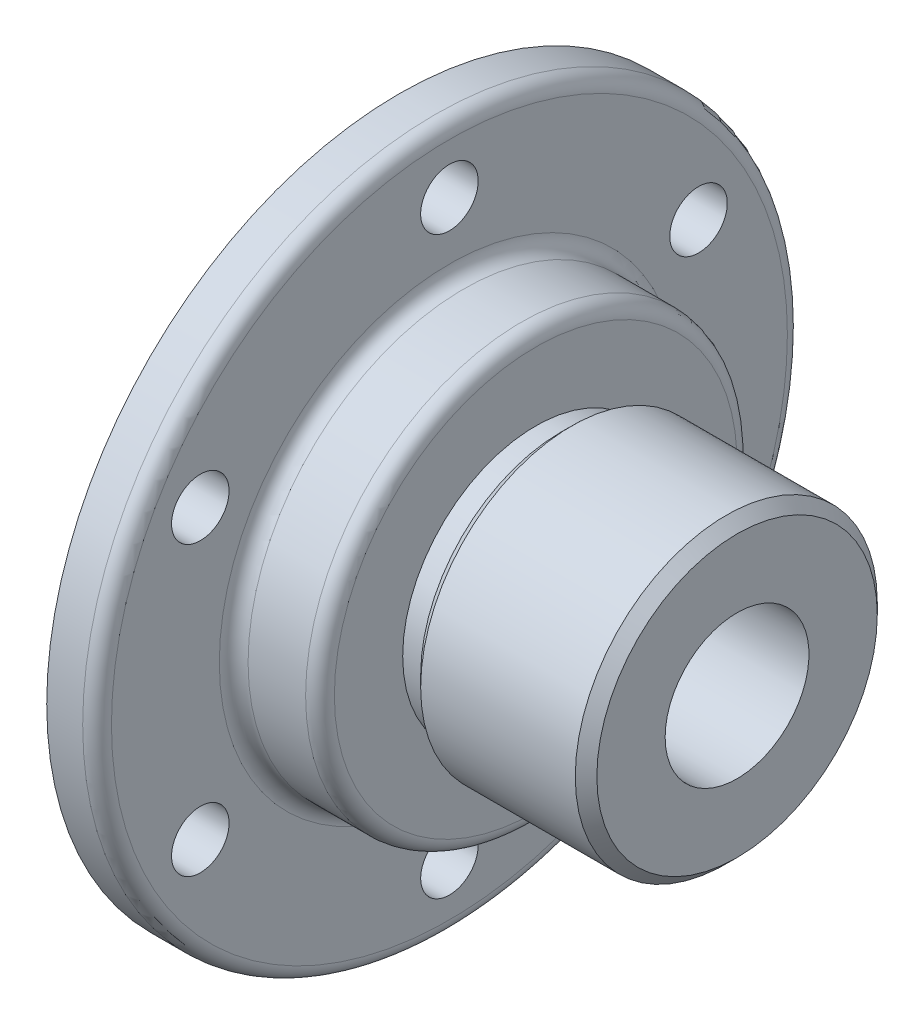
ISO-10303-21;
HEADER;
FILE_DESCRIPTION(('STEP AP214'),'2;1');
FILE_NAME('part.step','',(''),(''),'','','');
FILE_SCHEMA(('AUTOMOTIVE_DESIGN { 1 0 10303 214 1 1 1 1 }'));
ENDSEC;
DATA;
#1=APPLICATION_CONTEXT('core data for automotive mechanical design processes');
#2=APPLICATION_PROTOCOL_DEFINITION('international standard','automotive_design',2000,#1);
#3=PRODUCT_CONTEXT('',#1,'mechanical');
#4=PRODUCT('Part','Part','',(#3));
#5=PRODUCT_RELATED_PRODUCT_CATEGORY('part','',(#4));
#6=PRODUCT_DEFINITION_FORMATION('','',#4);
#7=PRODUCT_DEFINITION_CONTEXT('part definition',#1,'design');
#8=PRODUCT_DEFINITION('design','',#6,#7);
#9=PRODUCT_DEFINITION_SHAPE('','',#8);
#10=(LENGTH_UNIT() NAMED_UNIT(*) SI_UNIT(.MILLI.,.METRE.));
#11=(NAMED_UNIT(*) PLANE_ANGLE_UNIT() SI_UNIT($,.RADIAN.));
#12=(NAMED_UNIT(*) SI_UNIT($,.STERADIAN.) SOLID_ANGLE_UNIT());
#13=UNCERTAINTY_MEASURE_WITH_UNIT(LENGTH_MEASURE(1.E-05),#10,'distance_accuracy_value','');
#14=(GEOMETRIC_REPRESENTATION_CONTEXT(3) GLOBAL_UNCERTAINTY_ASSIGNED_CONTEXT((#13)) GLOBAL_UNIT_ASSIGNED_CONTEXT((#10,
#11,#12)) REPRESENTATION_CONTEXT('',''));
#15=CARTESIAN_POINT('',(0.,0.,0.));
#16=DIRECTION('',(0.,0.,1.));
#17=DIRECTION('',(1.,0.,0.));
#18=AXIS2_PLACEMENT_3D('',#15,#16,#17);
#19=CARTESIAN_POINT('',(0.,0.,0.));
#20=DIRECTION('',(1.,0.,0.));
#21=DIRECTION('',(0.,0.,-1.));
#22=AXIS2_PLACEMENT_3D('',#19,#20,#21);
#23=PLANE('',#22);
#24=CARTESIAN_POINT('',(0.,20.0000000000004,34.6410161513773));
#25=DIRECTION('',(1.,0.,0.));
#26=DIRECTION('',(0.,0.866025403784433,-0.50000000000001));
#27=AXIS2_PLACEMENT_3D('',#24,#25,#26);
#28=CIRCLE('',#27,4.);
#29=CARTESIAN_POINT('',(0.,23.4641016151381,32.6410161513773));
#30=VERTEX_POINT('',#29);
#31=EDGE_CURVE('E115',#30,#30,#28,.T.);
#32=ORIENTED_EDGE('',*,*,#31,.T.);
#33=EDGE_LOOP('',(#32));
#34=FACE_BOUND('',#33,.T.);
#35=CARTESIAN_POINT('',(0.,-19.9999999999997,34.6410161513777));
#36=DIRECTION('',(1.,0.,0.));
#37=DIRECTION('',(0.,0.866025403784443,0.499999999999992));
#38=AXIS2_PLACEMENT_3D('',#35,#36,#37);
#39=CIRCLE('',#38,4.);
#40=CARTESIAN_POINT('',(0.,-16.5358983848619,36.6410161513777));
#41=VERTEX_POINT('',#40);
#42=EDGE_CURVE('E109',#41,#41,#39,.T.);
#43=ORIENTED_EDGE('',*,*,#42,.T.);
#44=EDGE_LOOP('',(#43));
#45=FACE_BOUND('',#44,.T.);
#46=CARTESIAN_POINT('',(0.,-40.,2.79318668888751E-13));
#47=DIRECTION('',(1.,0.,0.));
#48=DIRECTION('',(0.,0.,1.));
#49=AXIS2_PLACEMENT_3D('',#46,#47,#48);
#50=CIRCLE('',#49,4.);
#51=CARTESIAN_POINT('',(0.,-40.,4.00000000000028));
#52=VERTEX_POINT('',#51);
#53=EDGE_CURVE('E103',#52,#52,#50,.T.);
#54=ORIENTED_EDGE('',*,*,#53,.T.);
#55=EDGE_LOOP('',(#54));
#56=FACE_BOUND('',#55,.T.);
#57=CARTESIAN_POINT('',(0.,-20.0000000000002,-34.6410161513775));
#58=DIRECTION('',(1.,0.,0.));
#59=DIRECTION('',(0.,-0.866025403784436,0.500000000000004));
#60=AXIS2_PLACEMENT_3D('',#57,#58,#59);
#61=CIRCLE('',#60,4.);
#62=CARTESIAN_POINT('',(0.,-23.4641016151379,-32.6410161513774));
#63=VERTEX_POINT('',#62);
#64=EDGE_CURVE('E97',#63,#63,#61,.T.);
#65=ORIENTED_EDGE('',*,*,#64,.T.);
#66=EDGE_LOOP('',(#65));
#67=FACE_BOUND('',#66,.T.);
#68=CARTESIAN_POINT('',(0.,19.9999999999999,-34.6410161513776));
#69=DIRECTION('',(1.,0.,0.));
#70=DIRECTION('',(0.,-0.86602540378444,-0.499999999999998));
#71=AXIS2_PLACEMENT_3D('',#68,#69,#70);
#72=CIRCLE('',#71,4.);
#73=CARTESIAN_POINT('',(0.,16.5358983848622,-36.6410161513776));
#74=VERTEX_POINT('',#73);
#75=EDGE_CURVE('E91',#74,#74,#72,.T.);
#76=ORIENTED_EDGE('',*,*,#75,.T.);
#77=EDGE_LOOP('',(#76));
#78=FACE_BOUND('',#77,.T.);
#79=CARTESIAN_POINT('',(0.,40.,0.));
#80=DIRECTION('',(1.,0.,0.));
#81=DIRECTION('',(0.,0.,-1.));
#82=AXIS2_PLACEMENT_3D('',#79,#80,#81);
#83=CIRCLE('',#82,4.);
#84=CARTESIAN_POINT('',(0.,40.,-4.));
#85=VERTEX_POINT('',#84);
#86=EDGE_CURVE('E87',#85,#85,#83,.T.);
#87=ORIENTED_EDGE('',*,*,#86,.T.);
#88=EDGE_LOOP('',(#87));
#89=FACE_BOUND('',#88,.T.);
#90=CARTESIAN_POINT('',(0.,0.,0.));
#91=DIRECTION('',(-1.,0.,0.));
#92=DIRECTION('',(0.,0.,1.));
#93=AXIS2_PLACEMENT_3D('',#90,#91,#92);
#94=CIRCLE('',#93,49.);
#95=CARTESIAN_POINT('',(0.,0.,49.));
#96=VERTEX_POINT('',#95);
#97=EDGE_CURVE('E66',#96,#96,#94,.T.);
#98=ORIENTED_EDGE('',*,*,#97,.T.);
#99=EDGE_LOOP('',(#98));
#100=FACE_BOUND('',#99,.T.);
#101=CARTESIAN_POINT('',(0.,0.,0.));
#102=DIRECTION('',(-1.,0.,0.));
#103=DIRECTION('',(0.,0.,1.));
#104=AXIS2_PLACEMENT_3D('',#101,#102,#103);
#105=CIRCLE('',#104,22.5);
#106=CARTESIAN_POINT('',(0.,0.,22.5));
#107=VERTEX_POINT('',#106);
#108=EDGE_CURVE('E84',#107,#107,#105,.T.);
#109=ORIENTED_EDGE('',*,*,#108,.F.);
#110=EDGE_LOOP('',(#109));
#111=FACE_BOUND('',#110,.T.);
#112=ADVANCED_FACE('F28',(#34,#45,#56,#67,#78,#89,#100,#111),#23,.F.);
#113=CARTESIAN_POINT('',(47.,21.,0.));
#114=DIRECTION('',(-1.,0.,0.));
#115=DIRECTION('',(0.,0.,1.));
#116=AXIS2_PLACEMENT_3D('',#113,#114,#115);
#117=PLANE('',#116);
#118=CARTESIAN_POINT('',(47.,0.,0.));
#119=DIRECTION('',(-1.,0.,0.));
#120=DIRECTION('',(0.,0.,1.));
#121=AXIS2_PLACEMENT_3D('',#118,#119,#120);
#122=CIRCLE('',#121,19.5);
#123=CARTESIAN_POINT('',(47.,0.,19.5));
#124=VERTEX_POINT('',#123);
#125=EDGE_CURVE('E54',#124,#124,#122,.F.);
#126=ORIENTED_EDGE('',*,*,#125,.T.);
#127=EDGE_LOOP('',(#126));
#128=FACE_BOUND('',#127,.T.);
#129=CARTESIAN_POINT('',(47.,0.,0.));
#130=DIRECTION('',(-1.,0.,0.));
#131=DIRECTION('',(0.,0.,1.));
#132=AXIS2_PLACEMENT_3D('',#129,#130,#131);
#133=CIRCLE('',#132,10.);
#134=CARTESIAN_POINT('',(47.,0.,10.));
#135=VERTEX_POINT('',#134);
#136=EDGE_CURVE('E75',#135,#135,#133,.T.);
#137=ORIENTED_EDGE('',*,*,#136,.T.);
#138=EDGE_LOOP('',(#137));
#139=FACE_BOUND('',#138,.T.);
#140=ADVANCED_FACE('F169',(#128,#139),#117,.F.);
#141=CARTESIAN_POINT('',(0.,0.,0.));
#142=DIRECTION('',(-1.,0.,0.));
#143=DIRECTION('',(0.,0.,1.));
#144=AXIS2_PLACEMENT_3D('',#141,#142,#143);
#145=CYLINDRICAL_SURFACE('',#144,49.);
#146=CARTESIAN_POINT('',(5.,0.,0.));
#147=DIRECTION('',(-1.,0.,0.));
#148=DIRECTION('',(0.,0.,1.));
#149=AXIS2_PLACEMENT_3D('',#146,#147,#148);
#150=CIRCLE('',#149,49.);
#151=CARTESIAN_POINT('',(5.,0.,49.));
#152=VERTEX_POINT('',#151);
#153=EDGE_CURVE('E10',#152,#152,#150,.T.);
#154=ORIENTED_EDGE('',*,*,#153,.T.);
#155=EDGE_LOOP('',(#154));
#156=FACE_BOUND('',#155,.T.);
#157=ORIENTED_EDGE('',*,*,#97,.F.);
#158=EDGE_LOOP('',(#157));
#159=FACE_BOUND('',#158,.T.);
#160=ADVANCED_FACE('F138',(#156,#159),#145,.T.);
#161=CARTESIAN_POINT('',(7.,49.,0.));
#162=DIRECTION('',(-1.,0.,0.));
#163=DIRECTION('',(0.,0.,1.));
#164=AXIS2_PLACEMENT_3D('',#161,#162,#163);
#165=PLANE('',#164);
#166=CARTESIAN_POINT('',(7.,0.,0.));
#167=DIRECTION('',(-1.,0.,0.));
#168=DIRECTION('',(0.,0.,1.));
#169=AXIS2_PLACEMENT_3D('',#166,#167,#168);
#170=CIRCLE('',#169,32.);
#171=CARTESIAN_POINT('',(7.,0.,32.));
#172=VERTEX_POINT('',#171);
#173=EDGE_CURVE('E35',#172,#172,#170,.T.);
#174=ORIENTED_EDGE('',*,*,#173,.T.);
#175=EDGE_LOOP('',(#174));
#176=FACE_BOUND('',#175,.T.);
#177=CARTESIAN_POINT('',(7.,0.,0.));
#178=DIRECTION('',(-1.,0.,0.));
#179=DIRECTION('',(0.,0.,1.));
#180=AXIS2_PLACEMENT_3D('',#177,#178,#179);
#181=CIRCLE('',#180,47.);
#182=CARTESIAN_POINT('',(7.,0.,47.));
#183=VERTEX_POINT('',#182);
#184=EDGE_CURVE('E39',#183,#183,#181,.F.);
#185=ORIENTED_EDGE('',*,*,#184,.T.);
#186=EDGE_LOOP('',(#185));
#187=FACE_BOUND('',#186,.T.);
#188=CARTESIAN_POINT('',(7.,20.0000000000004,34.6410161513773));
#189=DIRECTION('',(1.,0.,0.));
#190=DIRECTION('',(0.,0.866025403784433,-0.50000000000001));
#191=AXIS2_PLACEMENT_3D('',#188,#189,#190);
#192=CIRCLE('',#191,4.);
#193=CARTESIAN_POINT('',(7.,23.4641016151381,32.6410161513773));
#194=VERTEX_POINT('',#193);
#195=EDGE_CURVE('E118',#194,#194,#192,.T.);
#196=ORIENTED_EDGE('',*,*,#195,.F.);
#197=EDGE_LOOP('',(#196));
#198=FACE_BOUND('',#197,.T.);
#199=CARTESIAN_POINT('',(7.,-19.9999999999997,34.6410161513777));
#200=DIRECTION('',(1.,0.,0.));
#201=DIRECTION('',(0.,0.866025403784443,0.499999999999992));
#202=AXIS2_PLACEMENT_3D('',#199,#200,#201);
#203=CIRCLE('',#202,4.);
#204=CARTESIAN_POINT('',(7.,-16.5358983848619,36.6410161513777));
#205=VERTEX_POINT('',#204);
#206=EDGE_CURVE('E112',#205,#205,#203,.T.);
#207=ORIENTED_EDGE('',*,*,#206,.F.);
#208=EDGE_LOOP('',(#207));
#209=FACE_BOUND('',#208,.T.);
#210=CARTESIAN_POINT('',(7.,-40.,2.79318668888751E-13));
#211=DIRECTION('',(1.,0.,0.));
#212=DIRECTION('',(0.,0.,1.));
#213=AXIS2_PLACEMENT_3D('',#210,#211,#212);
#214=CIRCLE('',#213,4.);
#215=CARTESIAN_POINT('',(7.,-40.,4.00000000000028));
#216=VERTEX_POINT('',#215);
#217=EDGE_CURVE('E106',#216,#216,#214,.T.);
#218=ORIENTED_EDGE('',*,*,#217,.F.);
#219=EDGE_LOOP('',(#218));
#220=FACE_BOUND('',#219,.T.);
#221=CARTESIAN_POINT('',(7.,-20.0000000000002,-34.6410161513775));
#222=DIRECTION('',(1.,0.,0.));
#223=DIRECTION('',(0.,-0.866025403784436,0.500000000000004));
#224=AXIS2_PLACEMENT_3D('',#221,#222,#223);
#225=CIRCLE('',#224,4.);
#226=CARTESIAN_POINT('',(7.,-23.4641016151379,-32.6410161513774));
#227=VERTEX_POINT('',#226);
#228=EDGE_CURVE('E100',#227,#227,#225,.T.);
#229=ORIENTED_EDGE('',*,*,#228,.F.);
#230=EDGE_LOOP('',(#229));
#231=FACE_BOUND('',#230,.T.);
#232=CARTESIAN_POINT('',(7.,19.9999999999999,-34.6410161513776));
#233=DIRECTION('',(1.,0.,0.));
#234=DIRECTION('',(0.,-0.86602540378444,-0.499999999999998));
#235=AXIS2_PLACEMENT_3D('',#232,#233,#234);
#236=CIRCLE('',#235,4.);
#237=CARTESIAN_POINT('',(7.,16.5358983848622,-36.6410161513776));
#238=VERTEX_POINT('',#237);
#239=EDGE_CURVE('E94',#238,#238,#236,.T.);
#240=ORIENTED_EDGE('',*,*,#239,.F.);
#241=EDGE_LOOP('',(#240));
#242=FACE_BOUND('',#241,.T.);
#243=CARTESIAN_POINT('',(7.,40.,0.));
#244=DIRECTION('',(1.,0.,0.));
#245=DIRECTION('',(0.,0.,-1.));
#246=AXIS2_PLACEMENT_3D('',#243,#244,#245);
#247=CIRCLE('',#246,4.);
#248=CARTESIAN_POINT('',(7.,40.,-4.));
#249=VERTEX_POINT('',#248);
#250=EDGE_CURVE('E88',#249,#249,#247,.T.);
#251=ORIENTED_EDGE('',*,*,#250,.F.);
#252=EDGE_LOOP('',(#251));
#253=FACE_BOUND('',#252,.T.);
#254=ADVANCED_FACE('F134',(#176,#187,#198,#209,#220,#231,#242,#253),#165,.F.);
#255=CARTESIAN_POINT('',(0.,0.,0.));
#256=DIRECTION('',(-1.,0.,0.));
#257=DIRECTION('',(0.,0.,1.));
#258=AXIS2_PLACEMENT_3D('',#255,#256,#257);
#259=CYLINDRICAL_SURFACE('',#258,30.);
#260=CARTESIAN_POINT('',(17.,0.,0.));
#261=DIRECTION('',(-1.,0.,0.));
#262=DIRECTION('',(0.,0.,1.));
#263=AXIS2_PLACEMENT_3D('',#260,#261,#262);
#264=CIRCLE('',#263,30.);
#265=CARTESIAN_POINT('',(17.,0.,30.));
#266=VERTEX_POINT('',#265);
#267=EDGE_CURVE('E48',#266,#266,#264,.T.);
#268=ORIENTED_EDGE('',*,*,#267,.T.);
#269=EDGE_LOOP('',(#268));
#270=FACE_BOUND('',#269,.T.);
#271=CARTESIAN_POINT('',(9.,0.,0.));
#272=DIRECTION('',(-1.,0.,0.));
#273=DIRECTION('',(0.,0.,1.));
#274=AXIS2_PLACEMENT_3D('',#271,#272,#273);
#275=CIRCLE('',#274,30.);
#276=CARTESIAN_POINT('',(9.,0.,30.));
#277=VERTEX_POINT('',#276);
#278=EDGE_CURVE('E51',#277,#277,#275,.F.);
#279=ORIENTED_EDGE('',*,*,#278,.T.);
#280=EDGE_LOOP('',(#279));
#281=FACE_BOUND('',#280,.T.);
#282=ADVANCED_FACE('F137',(#270,#281),#259,.T.);
#283=CARTESIAN_POINT('',(19.,30.,0.));
#284=DIRECTION('',(-1.,0.,0.));
#285=DIRECTION('',(0.,0.,1.));
#286=AXIS2_PLACEMENT_3D('',#283,#284,#285);
#287=PLANE('',#286);
#288=CARTESIAN_POINT('',(19.,0.,0.));
#289=DIRECTION('',(-1.,0.,0.));
#290=DIRECTION('',(0.,0.,1.));
#291=AXIS2_PLACEMENT_3D('',#288,#289,#290);
#292=CIRCLE('',#291,28.);
#293=CARTESIAN_POINT('',(19.,0.,28.));
#294=VERTEX_POINT('',#293);
#295=EDGE_CURVE('E43',#294,#294,#292,.F.);
#296=ORIENTED_EDGE('',*,*,#295,.T.);
#297=EDGE_LOOP('',(#296));
#298=FACE_BOUND('',#297,.T.);
#299=CARTESIAN_POINT('',(19.,0.,0.));
#300=DIRECTION('',(-1.,0.,0.));
#301=DIRECTION('',(0.,0.,1.));
#302=AXIS2_PLACEMENT_3D('',#299,#300,#301);
#303=CIRCLE('',#302,18.5);
#304=CARTESIAN_POINT('',(19.,0.,18.5));
#305=VERTEX_POINT('',#304);
#306=EDGE_CURVE('E69',#305,#305,#303,.T.);
#307=ORIENTED_EDGE('',*,*,#306,.T.);
#308=EDGE_LOOP('',(#307));
#309=FACE_BOUND('',#308,.T.);
#310=ADVANCED_FACE('F195',(#298,#309),#287,.F.);
#311=CARTESIAN_POINT('',(0.,0.,0.));
#312=DIRECTION('',(-1.,0.,0.));
#313=DIRECTION('',(0.,0.,1.));
#314=AXIS2_PLACEMENT_3D('',#311,#312,#313);
#315=CYLINDRICAL_SURFACE('',#314,18.5);
#316=ORIENTED_EDGE('',*,*,#306,.F.);
#317=EDGE_LOOP('',(#316));
#318=FACE_BOUND('',#317,.T.);
#319=CARTESIAN_POINT('',(22.5,0.,0.));
#320=DIRECTION('',(-1.,0.,0.));
#321=DIRECTION('',(0.,0.,1.));
#322=AXIS2_PLACEMENT_3D('',#319,#320,#321);
#323=CIRCLE('',#322,18.5);
#324=CARTESIAN_POINT('',(22.5,0.,18.5));
#325=VERTEX_POINT('',#324);
#326=EDGE_CURVE('E72',#325,#325,#323,.T.);
#327=ORIENTED_EDGE('',*,*,#326,.T.);
#328=EDGE_LOOP('',(#327));
#329=FACE_BOUND('',#328,.T.);
#330=ADVANCED_FACE('F201',(#318,#329),#315,.T.);
#331=CARTESIAN_POINT('',(22.5,18.5,0.));
#332=DIRECTION('',(1.,0.,0.));
#333=DIRECTION('',(0.,0.,-1.));
#334=AXIS2_PLACEMENT_3D('',#331,#332,#333);
#335=PLANE('',#334);
#336=CARTESIAN_POINT('',(22.5,0.,0.));
#337=DIRECTION('',(1.,0.,0.));
#338=DIRECTION('',(0.,0.,-1.));
#339=AXIS2_PLACEMENT_3D('',#336,#337,#338);
#340=CIRCLE('',#339,19.5);
#341=CARTESIAN_POINT('',(22.5,0.,-19.5));
#342=VERTEX_POINT('',#341);
#343=EDGE_CURVE('E63',#342,#342,#340,.F.);
#344=ORIENTED_EDGE('',*,*,#343,.T.);
#345=EDGE_LOOP('',(#344));
#346=FACE_BOUND('',#345,.T.);
#347=ORIENTED_EDGE('',*,*,#326,.F.);
#348=EDGE_LOOP('',(#347));
#349=FACE_BOUND('',#348,.T.);
#350=ADVANCED_FACE('F207',(#346,#349),#335,.F.);
#351=CARTESIAN_POINT('',(0.,0.,0.));
#352=DIRECTION('',(-1.,0.,0.));
#353=DIRECTION('',(0.,0.,1.));
#354=AXIS2_PLACEMENT_3D('',#351,#352,#353);
#355=CYLINDRICAL_SURFACE('',#354,21.);
#356=CARTESIAN_POINT('',(24.,0.,0.));
#357=DIRECTION('',(1.,0.,0.));
#358=DIRECTION('',(0.,0.,-1.));
#359=AXIS2_PLACEMENT_3D('',#356,#357,#358);
#360=CIRCLE('',#359,21.);
#361=CARTESIAN_POINT('',(24.,0.,-21.));
#362=VERTEX_POINT('',#361);
#363=EDGE_CURVE('E57',#362,#362,#360,.T.);
#364=ORIENTED_EDGE('',*,*,#363,.T.);
#365=EDGE_LOOP('',(#364));
#366=FACE_BOUND('',#365,.T.);
#367=CARTESIAN_POINT('',(45.5,0.,0.));
#368=DIRECTION('',(-1.,0.,0.));
#369=DIRECTION('',(0.,0.,1.));
#370=AXIS2_PLACEMENT_3D('',#367,#368,#369);
#371=CIRCLE('',#370,21.);
#372=CARTESIAN_POINT('',(45.5,0.,21.));
#373=VERTEX_POINT('',#372);
#374=EDGE_CURVE('E60',#373,#373,#371,.T.);
#375=ORIENTED_EDGE('',*,*,#374,.T.);
#376=EDGE_LOOP('',(#375));
#377=FACE_BOUND('',#376,.T.);
#378=ADVANCED_FACE('F211',(#366,#377),#355,.T.);
#379=CARTESIAN_POINT('',(0.,0.,0.));
#380=DIRECTION('',(-1.,0.,0.));
#381=DIRECTION('',(0.,0.,1.));
#382=AXIS2_PLACEMENT_3D('',#379,#380,#381);
#383=CYLINDRICAL_SURFACE('',#382,10.);
#384=CARTESIAN_POINT('',(10.,0.,0.));
#385=DIRECTION('',(-1.,0.,0.));
#386=DIRECTION('',(0.,0.,1.));
#387=AXIS2_PLACEMENT_3D('',#384,#385,#386);
#388=CIRCLE('',#387,9.99999999999999);
#389=CARTESIAN_POINT('',(10.,0.,9.99999999999999));
#390=VERTEX_POINT('',#389);
#391=EDGE_CURVE('E78',#390,#390,#388,.T.);
#392=ORIENTED_EDGE('',*,*,#391,.T.);
#393=EDGE_LOOP('',(#392));
#394=FACE_BOUND('',#393,.T.);
#395=ORIENTED_EDGE('',*,*,#136,.F.);
#396=EDGE_LOOP('',(#395));
#397=FACE_BOUND('',#396,.T.);
#398=ADVANCED_FACE('F214',(#394,#397),#383,.F.);
#399=CARTESIAN_POINT('',(10.,9.99999999999999,0.));
#400=DIRECTION('',(-1.,0.,0.));
#401=DIRECTION('',(0.,0.,1.));
#402=AXIS2_PLACEMENT_3D('',#399,#400,#401);
#403=PLANE('',#402);
#404=CARTESIAN_POINT('',(10.,0.,0.));
#405=DIRECTION('',(-1.,0.,0.));
#406=DIRECTION('',(0.,0.,1.));
#407=AXIS2_PLACEMENT_3D('',#404,#405,#406);
#408=CIRCLE('',#407,22.5);
#409=CARTESIAN_POINT('',(10.,0.,22.5));
#410=VERTEX_POINT('',#409);
#411=EDGE_CURVE('E81',#410,#410,#408,.T.);
#412=ORIENTED_EDGE('',*,*,#411,.T.);
#413=EDGE_LOOP('',(#412));
#414=FACE_BOUND('',#413,.T.);
#415=ORIENTED_EDGE('',*,*,#391,.F.);
#416=EDGE_LOOP('',(#415));
#417=FACE_BOUND('',#416,.T.);
#418=ADVANCED_FACE('F219',(#414,#417),#403,.T.);
#419=CARTESIAN_POINT('',(0.,0.,0.));
#420=DIRECTION('',(-1.,0.,0.));
#421=DIRECTION('',(0.,0.,1.));
#422=AXIS2_PLACEMENT_3D('',#419,#420,#421);
#423=CYLINDRICAL_SURFACE('',#422,22.5);
#424=ORIENTED_EDGE('',*,*,#108,.T.);
#425=EDGE_LOOP('',(#424));
#426=FACE_BOUND('',#425,.T.);
#427=ORIENTED_EDGE('',*,*,#411,.F.);
#428=EDGE_LOOP('',(#427));
#429=FACE_BOUND('',#428,.T.);
#430=ADVANCED_FACE('F179',(#426,#429),#423,.F.);
#431=CARTESIAN_POINT('',(22.5,0.,0.));
#432=DIRECTION('',(1.,0.,0.));
#433=DIRECTION('',(0.,0.,-1.));
#434=AXIS2_PLACEMENT_3D('',#431,#432,#433);
#435=CONICAL_SURFACE('',#434,19.5,0.785398163397446);
#436=ORIENTED_EDGE('',*,*,#363,.F.);
#437=EDGE_LOOP('',(#436));
#438=FACE_BOUND('',#437,.T.);
#439=ORIENTED_EDGE('',*,*,#343,.F.);
#440=EDGE_LOOP('',(#439));
#441=FACE_BOUND('',#440,.T.);
#442=ADVANCED_FACE('F163',(#438,#441),#435,.T.);
#443=CARTESIAN_POINT('',(45.5,0.,0.));
#444=DIRECTION('',(-1.,0.,0.));
#445=DIRECTION('',(0.,0.,1.));
#446=AXIS2_PLACEMENT_3D('',#443,#444,#445);
#447=CONICAL_SURFACE('',#446,21.,0.785398163397452);
#448=CARTESIAN_POINT('',(47.,0.,19.5));
#449=CARTESIAN_POINT('',(46.984375,0.,19.515625));
#450=CARTESIAN_POINT('',(46.96875,0.,19.53125));
#451=CARTESIAN_POINT('',(46.9375,0.,19.5625));
#452=CARTESIAN_POINT('',(46.921875,0.,19.578125));
#453=CARTESIAN_POINT('',(46.890625,0.,19.609375));
#454=CARTESIAN_POINT('',(46.875,0.,19.625));
#455=CARTESIAN_POINT('',(46.84375,0.,19.65625));
#456=CARTESIAN_POINT('',(46.828125,0.,19.671875));
#457=CARTESIAN_POINT('',(46.796875,0.,19.703125));
#458=CARTESIAN_POINT('',(46.78125,0.,19.71875));
#459=CARTESIAN_POINT('',(46.75,0.,19.75));
#460=CARTESIAN_POINT('',(46.734375,0.,19.765625));
#461=CARTESIAN_POINT('',(46.703125,0.,19.796875));
#462=CARTESIAN_POINT('',(46.6875,0.,19.8125));
#463=CARTESIAN_POINT('',(46.65625,0.,19.84375));
#464=CARTESIAN_POINT('',(46.640625,0.,19.859375));
#465=CARTESIAN_POINT('',(46.609375,0.,19.890625));
#466=CARTESIAN_POINT('',(46.59375,0.,19.90625));
#467=CARTESIAN_POINT('',(46.5625,0.,19.9375));
#468=CARTESIAN_POINT('',(46.546875,0.,19.953125));
#469=CARTESIAN_POINT('',(46.515625,0.,19.984375));
#470=CARTESIAN_POINT('',(46.5,0.,20.));
#471=CARTESIAN_POINT('',(46.46875,0.,20.03125));
#472=CARTESIAN_POINT('',(46.453125,0.,20.046875));
#473=CARTESIAN_POINT('',(46.421875,0.,20.078125));
#474=CARTESIAN_POINT('',(46.40625,0.,20.09375));
#475=CARTESIAN_POINT('',(46.375,0.,20.125));
#476=CARTESIAN_POINT('',(46.359375,0.,20.140625));
#477=CARTESIAN_POINT('',(46.328125,0.,20.171875));
#478=CARTESIAN_POINT('',(46.3125,0.,20.1875));
#479=CARTESIAN_POINT('',(46.28125,0.,20.21875));
#480=CARTESIAN_POINT('',(46.265625,0.,20.234375));
#481=CARTESIAN_POINT('',(46.234375,0.,20.265625));
#482=CARTESIAN_POINT('',(46.21875,0.,20.28125));
#483=CARTESIAN_POINT('',(46.1875,0.,20.3125));
#484=CARTESIAN_POINT('',(46.171875,0.,20.328125));
#485=CARTESIAN_POINT('',(46.140625,0.,20.359375));
#486=CARTESIAN_POINT('',(46.125,0.,20.375));
#487=CARTESIAN_POINT('',(46.09375,0.,20.40625));
#488=CARTESIAN_POINT('',(46.078125,0.,20.421875));
#489=CARTESIAN_POINT('',(46.046875,0.,20.453125));
#490=CARTESIAN_POINT('',(46.03125,0.,20.46875));
#491=CARTESIAN_POINT('',(46.,0.,20.5));
#492=CARTESIAN_POINT('',(45.984375,0.,20.515625));
#493=CARTESIAN_POINT('',(45.953125,0.,20.546875));
#494=CARTESIAN_POINT('',(45.9375,0.,20.5625));
#495=CARTESIAN_POINT('',(45.90625,0.,20.59375));
#496=CARTESIAN_POINT('',(45.890625,0.,20.609375));
#497=CARTESIAN_POINT('',(45.859375,0.,20.640625));
#498=CARTESIAN_POINT('',(45.84375,0.,20.65625));
#499=CARTESIAN_POINT('',(45.8125,0.,20.6875));
#500=CARTESIAN_POINT('',(45.796875,0.,20.703125));
#501=CARTESIAN_POINT('',(45.765625,0.,20.734375));
#502=CARTESIAN_POINT('',(45.75,0.,20.75));
#503=CARTESIAN_POINT('',(45.71875,0.,20.78125));
#504=CARTESIAN_POINT('',(45.703125,0.,20.796875));
#505=CARTESIAN_POINT('',(45.671875,0.,20.828125));
#506=CARTESIAN_POINT('',(45.65625,0.,20.84375));
#507=CARTESIAN_POINT('',(45.625,0.,20.875));
#508=CARTESIAN_POINT('',(45.609375,0.,20.890625));
#509=CARTESIAN_POINT('',(45.578125,0.,20.921875));
#510=CARTESIAN_POINT('',(45.5625,0.,20.9375));
#511=CARTESIAN_POINT('',(45.53125,0.,20.96875));
#512=CARTESIAN_POINT('',(45.515625,0.,20.984375));
#513=CARTESIAN_POINT('',(45.5,0.,21.));
#514=B_SPLINE_CURVE_WITH_KNOTS('',3,(#448,#449,#450,#451,#452,#453,#454,#455,#456,#457,#458,
#459,#460,#461,#462,#463,#464,#465,#466,#467,#468,#469,#470,#471,#472,#473,#474,#475,#476,#477,
#478,#479,#480,#481,#482,#483,#484,#485,#486,#487,#488,#489,#490,#491,#492,#493,#494,#495,#496,
#497,#498,#499,#500,#501,#502,#503,#504,#505,#506,#507,#508,#509,#510,#511,#512,#513),
.UNSPECIFIED.,.F.,.F.,(4,2,2,2,2,2,2,2,2,2,2,2,2,2,2,2,2,2,2,2,2,2,2,2,2,2,2,2,2,2,2,2,4),(0.,
0.0662912607362389,0.13258252147248,0.198873782208719,0.265165042944956,0.331456303681194,
0.397747564417436,0.46403882515367,0.530330085889911,0.59662134662615,0.662912607362387,
0.729203868098625,0.795495128834867,0.861786389571101,0.928077650307342,0.994368911043581,
1.06066017177981,1.12695143251606,1.1932426932523,1.25953395398854,1.32582521472477,
1.39211647546101,1.45840773619725,1.52469899693349,1.59099025766973,1.65728151840597,
1.7235727791422,1.78986403987844,1.85615530061468,1.92244656135092,1.98873782208716,
2.0550290828234,2.12132034355964),.UNSPECIFIED.);
#515=EDGE_CURVE('BSEAM153',#124,#373,#514,.T.);
#516=ORIENTED_EDGE('',*,*,#125,.F.);
#517=ORIENTED_EDGE('',*,*,#374,.F.);
#518=ORIENTED_EDGE('',*,*,#515,.T.);
#519=ORIENTED_EDGE('',*,*,#515,.F.);
#520=EDGE_LOOP('',(#516,#518,#517,#519));
#521=FACE_BOUND('',#520,.T.);
#522=ADVANCED_FACE('F153',(#521),#447,.T.);
#523=CARTESIAN_POINT('',(0.,40.,0.));
#524=DIRECTION('',(1.,0.,0.));
#525=DIRECTION('',(0.,0.,-1.));
#526=AXIS2_PLACEMENT_3D('',#523,#524,#525);
#527=CYLINDRICAL_SURFACE('',#526,4.);
#528=ORIENTED_EDGE('',*,*,#86,.F.);
#529=EDGE_LOOP('',(#528));
#530=FACE_BOUND('',#529,.T.);
#531=ORIENTED_EDGE('',*,*,#250,.T.);
#532=EDGE_LOOP('',(#531));
#533=FACE_BOUND('',#532,.T.);
#534=ADVANCED_FACE('F150',(#530,#533),#527,.F.);
#535=CARTESIAN_POINT('',(0.,19.9999999999999,-34.6410161513776));
#536=DIRECTION('',(1.,0.,0.));
#537=DIRECTION('',(0.,0.,-1.));
#538=AXIS2_PLACEMENT_3D('',#535,#536,#537);
#539=CYLINDRICAL_SURFACE('',#538,4.);
#540=ORIENTED_EDGE('',*,*,#75,.F.);
#541=EDGE_LOOP('',(#540));
#542=FACE_BOUND('',#541,.T.);
#543=ORIENTED_EDGE('',*,*,#239,.T.);
#544=EDGE_LOOP('',(#543));
#545=FACE_BOUND('',#544,.T.);
#546=ADVANCED_FACE('F152',(#542,#545),#539,.F.);
#547=CARTESIAN_POINT('',(0.,-20.0000000000002,-34.6410161513775));
#548=DIRECTION('',(1.,0.,0.));
#549=DIRECTION('',(0.,0.,-1.));
#550=AXIS2_PLACEMENT_3D('',#547,#548,#549);
#551=CYLINDRICAL_SURFACE('',#550,4.);
#552=ORIENTED_EDGE('',*,*,#64,.F.);
#553=EDGE_LOOP('',(#552));
#554=FACE_BOUND('',#553,.T.);
#555=ORIENTED_EDGE('',*,*,#228,.T.);
#556=EDGE_LOOP('',(#555));
#557=FACE_BOUND('',#556,.T.);
#558=ADVANCED_FACE('F160',(#554,#557),#551,.F.);
#559=CARTESIAN_POINT('',(0.,-40.,2.79318668888751E-13));
#560=DIRECTION('',(1.,0.,0.));
#561=DIRECTION('',(0.,0.,-1.));
#562=AXIS2_PLACEMENT_3D('',#559,#560,#561);
#563=CYLINDRICAL_SURFACE('',#562,4.);
#564=ORIENTED_EDGE('',*,*,#53,.F.);
#565=EDGE_LOOP('',(#564));
#566=FACE_BOUND('',#565,.T.);
#567=ORIENTED_EDGE('',*,*,#217,.T.);
#568=EDGE_LOOP('',(#567));
#569=FACE_BOUND('',#568,.T.);
#570=ADVANCED_FACE('F273',(#566,#569),#563,.F.);
#571=CARTESIAN_POINT('',(0.,-19.9999999999997,34.6410161513777));
#572=DIRECTION('',(1.,0.,0.));
#573=DIRECTION('',(0.,0.,-1.));
#574=AXIS2_PLACEMENT_3D('',#571,#572,#573);
#575=CYLINDRICAL_SURFACE('',#574,4.);
#576=ORIENTED_EDGE('',*,*,#42,.F.);
#577=EDGE_LOOP('',(#576));
#578=FACE_BOUND('',#577,.T.);
#579=ORIENTED_EDGE('',*,*,#206,.T.);
#580=EDGE_LOOP('',(#579));
#581=FACE_BOUND('',#580,.T.);
#582=ADVANCED_FACE('F130',(#578,#581),#575,.F.);
#583=CARTESIAN_POINT('',(0.,20.0000000000004,34.6410161513773));
#584=DIRECTION('',(1.,0.,0.));
#585=DIRECTION('',(0.,0.,-1.));
#586=AXIS2_PLACEMENT_3D('',#583,#584,#585);
#587=CYLINDRICAL_SURFACE('',#586,4.);
#588=ORIENTED_EDGE('',*,*,#31,.F.);
#589=EDGE_LOOP('',(#588));
#590=FACE_BOUND('',#589,.T.);
#591=ORIENTED_EDGE('',*,*,#195,.T.);
#592=EDGE_LOOP('',(#591));
#593=FACE_BOUND('',#592,.T.);
#594=ADVANCED_FACE('F126',(#590,#593),#587,.F.);
#595=CARTESIAN_POINT('',(17.,0.,0.));
#596=DIRECTION('',(-1.,0.,0.));
#597=DIRECTION('',(0.,0.,1.));
#598=AXIS2_PLACEMENT_3D('',#595,#596,#597);
#599=TOROIDAL_SURFACE('',#598,28.,2.);
#600=ORIENTED_EDGE('',*,*,#295,.F.);
#601=EDGE_LOOP('',(#600));
#602=FACE_BOUND('',#601,.T.);
#603=ORIENTED_EDGE('',*,*,#267,.F.);
#604=EDGE_LOOP('',(#603));
#605=FACE_BOUND('',#604,.T.);
#606=ADVANCED_FACE('F129',(#602,#605),#599,.T.);
#607=CARTESIAN_POINT('',(9.,0.,0.));
#608=DIRECTION('',(-1.,0.,0.));
#609=DIRECTION('',(0.,0.,1.));
#610=AXIS2_PLACEMENT_3D('',#607,#608,#609);
#611=TOROIDAL_SURFACE('',#610,32.,2.);
#612=ORIENTED_EDGE('',*,*,#278,.F.);
#613=EDGE_LOOP('',(#612));
#614=FACE_BOUND('',#613,.T.);
#615=ORIENTED_EDGE('',*,*,#173,.F.);
#616=EDGE_LOOP('',(#615));
#617=FACE_BOUND('',#616,.T.);
#618=ADVANCED_FACE('F183',(#614,#617),#611,.F.);
#619=CARTESIAN_POINT('',(5.,0.,0.));
#620=DIRECTION('',(-1.,0.,0.));
#621=DIRECTION('',(0.,0.,1.));
#622=AXIS2_PLACEMENT_3D('',#619,#620,#621);
#623=TOROIDAL_SURFACE('',#622,47.,2.);
#624=ORIENTED_EDGE('',*,*,#184,.F.);
#625=EDGE_LOOP('',(#624));
#626=FACE_BOUND('',#625,.T.);
#627=ORIENTED_EDGE('',*,*,#153,.F.);
#628=EDGE_LOOP('',(#627));
#629=FACE_BOUND('',#628,.T.);
#630=ADVANCED_FACE('F30',(#626,#629),#623,.T.);
#631=CLOSED_SHELL('',(#112,#140,#160,#254,#282,#310,#330,#350,#378,#398,#418,#430,#442,#522,
#534,#546,#558,#570,#582,#594,#606,#618,#630));
#632=MANIFOLD_SOLID_BREP('B2',#631);
#633=ADVANCED_BREP_SHAPE_REPRESENTATION('',(#18,#632),#14);
#634=SHAPE_DEFINITION_REPRESENTATION(#9,#633);
ENDSEC;
END-ISO-10303-21;
